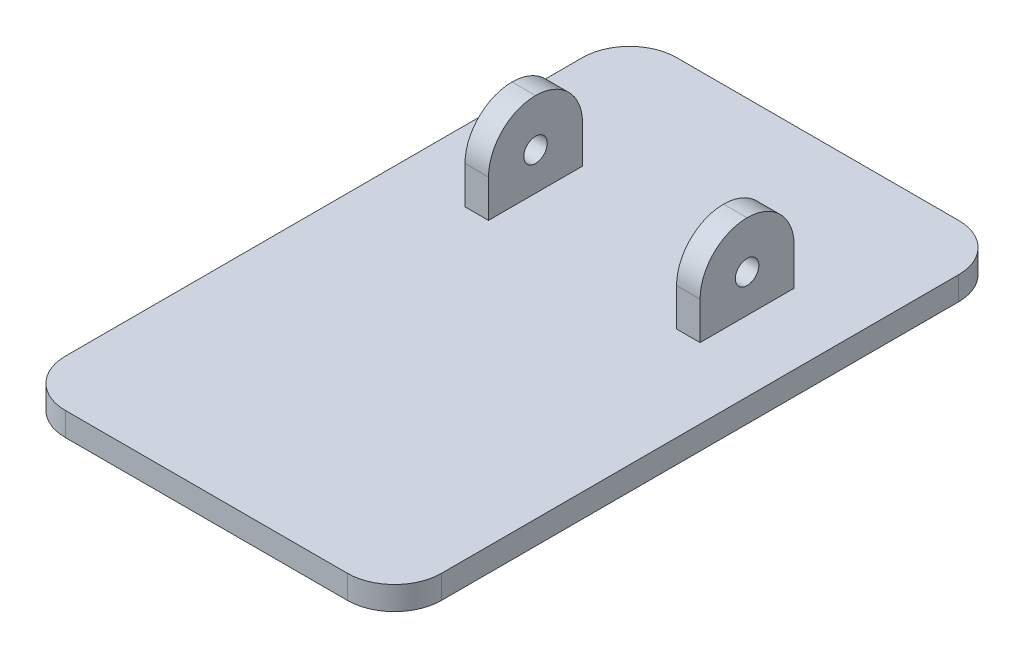
ISO-10303-21;
HEADER;
FILE_DESCRIPTION(('STEP AP214'),'2;1');
FILE_NAME('part.step','',(''),(''),'','','');
FILE_SCHEMA(('AUTOMOTIVE_DESIGN { 1 0 10303 214 1 1 1 1 }'));
ENDSEC;
DATA;
#1=APPLICATION_CONTEXT('core data for automotive mechanical design processes');
#2=APPLICATION_PROTOCOL_DEFINITION('international standard','automotive_design',2000,#1);
#3=PRODUCT_CONTEXT('',#1,'mechanical');
#4=PRODUCT('Part','Part','',(#3));
#5=PRODUCT_RELATED_PRODUCT_CATEGORY('part','',(#4));
#6=PRODUCT_DEFINITION_FORMATION('','',#4);
#7=PRODUCT_DEFINITION_CONTEXT('part definition',#1,'design');
#8=PRODUCT_DEFINITION('design','',#6,#7);
#9=PRODUCT_DEFINITION_SHAPE('','',#8);
#10=(LENGTH_UNIT() NAMED_UNIT(*) SI_UNIT(.MILLI.,.METRE.));
#11=(NAMED_UNIT(*) PLANE_ANGLE_UNIT() SI_UNIT($,.RADIAN.));
#12=(NAMED_UNIT(*) SI_UNIT($,.STERADIAN.) SOLID_ANGLE_UNIT());
#13=UNCERTAINTY_MEASURE_WITH_UNIT(LENGTH_MEASURE(1.E-05),#10,'distance_accuracy_value','');
#14=(GEOMETRIC_REPRESENTATION_CONTEXT(3) GLOBAL_UNCERTAINTY_ASSIGNED_CONTEXT((#13)) GLOBAL_UNIT_ASSIGNED_CONTEXT((#10,
#11,#12)) REPRESENTATION_CONTEXT('',''));
#15=CARTESIAN_POINT('',(0.,0.,0.));
#16=DIRECTION('',(0.,0.,1.));
#17=DIRECTION('',(1.,0.,0.));
#18=AXIS2_PLACEMENT_3D('',#15,#16,#17);
#19=CARTESIAN_POINT('',(40.,5.,-65.));
#20=DIRECTION('',(0.,0.,1.));
#21=DIRECTION('',(1.,0.,0.));
#22=AXIS2_PLACEMENT_3D('',#19,#20,#21);
#23=PLANE('',#22);
#24=DIRECTION('',(-1.,0.,0.));
#25=VECTOR('',#24,1.);
#26=CARTESIAN_POINT('',(40.,5.,-65.));
#27=LINE('',#26,#25);
#28=CARTESIAN_POINT('',(30.,5.,-65.));
#29=VERTEX_POINT('',#28);
#30=CARTESIAN_POINT('',(-30.,5.,-65.));
#31=VERTEX_POINT('',#30);
#32=EDGE_CURVE('E245',#29,#31,#27,.T.);
#33=ORIENTED_EDGE('',*,*,#32,.F.);
#34=DIRECTION('',(0.,-1.,0.));
#35=VECTOR('',#34,1.);
#36=CARTESIAN_POINT('',(30.,5.,-65.));
#37=LINE('',#36,#35);
#38=CARTESIAN_POINT('',(30.,0.,-65.));
#39=VERTEX_POINT('',#38);
#40=EDGE_CURVE('E324',#29,#39,#37,.T.);
#41=ORIENTED_EDGE('',*,*,#40,.T.);
#42=DIRECTION('',(-1.,0.,0.));
#43=VECTOR('',#42,1.);
#44=CARTESIAN_POINT('',(40.,0.,-65.));
#45=LINE('',#44,#43);
#46=CARTESIAN_POINT('',(-30.,0.,-65.));
#47=VERTEX_POINT('',#46);
#48=EDGE_CURVE('E244',#39,#47,#45,.T.);
#49=ORIENTED_EDGE('',*,*,#48,.T.);
#50=DIRECTION('',(0.,-1.,0.));
#51=VECTOR('',#50,1.);
#52=CARTESIAN_POINT('',(-30.,5.,-65.));
#53=LINE('',#52,#51);
#54=EDGE_CURVE('E321',#47,#31,#53,.F.);
#55=ORIENTED_EDGE('',*,*,#54,.T.);
#56=EDGE_LOOP('',(#33,#41,#49,#55));
#57=FACE_BOUND('',#56,.T.);
#58=ADVANCED_FACE('F47',(#57),#23,.F.);
#59=CARTESIAN_POINT('',(-40.,5.,65.));
#60=DIRECTION('',(-1.,0.,0.));
#61=DIRECTION('',(0.,0.,1.));
#62=AXIS2_PLACEMENT_3D('',#59,#60,#61);
#63=PLANE('',#62);
#64=DIRECTION('',(0.,0.,-1.));
#65=VECTOR('',#64,1.);
#66=CARTESIAN_POINT('',(-40.,0.,65.));
#67=LINE('',#66,#65);
#68=CARTESIAN_POINT('',(-40.,0.,55.));
#69=VERTEX_POINT('',#68);
#70=CARTESIAN_POINT('',(-40.,0.,-55.));
#71=VERTEX_POINT('',#70);
#72=EDGE_CURVE('E266',#69,#71,#67,.T.);
#73=ORIENTED_EDGE('',*,*,#72,.F.);
#74=DIRECTION('',(0.,-1.,0.));
#75=VECTOR('',#74,1.);
#76=CARTESIAN_POINT('',(-40.,5.,55.));
#77=LINE('',#76,#75);
#78=CARTESIAN_POINT('',(-40.,5.,55.));
#79=VERTEX_POINT('',#78);
#80=EDGE_CURVE('E299',#69,#79,#77,.F.);
#81=ORIENTED_EDGE('',*,*,#80,.T.);
#82=DIRECTION('',(0.,0.,-1.));
#83=VECTOR('',#82,1.);
#84=CARTESIAN_POINT('',(-40.,5.,65.));
#85=LINE('',#84,#83);
#86=CARTESIAN_POINT('',(-40.,5.,-55.));
#87=VERTEX_POINT('',#86);
#88=EDGE_CURVE('E249',#79,#87,#85,.T.);
#89=ORIENTED_EDGE('',*,*,#88,.T.);
#90=DIRECTION('',(0.,-1.,0.));
#91=VECTOR('',#90,1.);
#92=CARTESIAN_POINT('',(-40.,0.,-55.));
#93=LINE('',#92,#91);
#94=EDGE_CURVE('E295',#87,#71,#93,.T.);
#95=ORIENTED_EDGE('',*,*,#94,.T.);
#96=EDGE_LOOP('',(#73,#81,#89,#95));
#97=FACE_BOUND('',#96,.T.);
#98=ADVANCED_FACE('F414',(#97),#63,.T.);
#99=CARTESIAN_POINT('',(40.,5.,65.));
#100=DIRECTION('',(0.,0.,1.));
#101=DIRECTION('',(1.,0.,0.));
#102=AXIS2_PLACEMENT_3D('',#99,#100,#101);
#103=PLANE('',#102);
#104=DIRECTION('',(-1.,0.,0.));
#105=VECTOR('',#104,1.);
#106=CARTESIAN_POINT('',(40.,5.,65.));
#107=LINE('',#106,#105);
#108=CARTESIAN_POINT('',(30.,5.,65.));
#109=VERTEX_POINT('',#108);
#110=CARTESIAN_POINT('',(-30.,5.,65.));
#111=VERTEX_POINT('',#110);
#112=EDGE_CURVE('E254',#109,#111,#107,.T.);
#113=ORIENTED_EDGE('',*,*,#112,.T.);
#114=DIRECTION('',(0.,-1.,0.));
#115=VECTOR('',#114,1.);
#116=CARTESIAN_POINT('',(-30.,5.,65.));
#117=LINE('',#116,#115);
#118=CARTESIAN_POINT('',(-30.,0.,65.));
#119=VERTEX_POINT('',#118);
#120=EDGE_CURVE('E279',#111,#119,#117,.T.);
#121=ORIENTED_EDGE('',*,*,#120,.T.);
#122=DIRECTION('',(-1.,0.,0.));
#123=VECTOR('',#122,1.);
#124=CARTESIAN_POINT('',(40.,0.,65.));
#125=LINE('',#124,#123);
#126=CARTESIAN_POINT('',(30.,0.,65.));
#127=VERTEX_POINT('',#126);
#128=EDGE_CURVE('E270',#127,#119,#125,.T.);
#129=ORIENTED_EDGE('',*,*,#128,.F.);
#130=DIRECTION('',(0.,-1.,0.));
#131=VECTOR('',#130,1.);
#132=CARTESIAN_POINT('',(30.,5.,65.));
#133=LINE('',#132,#131);
#134=EDGE_CURVE('E262',#127,#109,#133,.F.);
#135=ORIENTED_EDGE('',*,*,#134,.T.);
#136=EDGE_LOOP('',(#113,#121,#129,#135));
#137=FACE_BOUND('',#136,.T.);
#138=ADVANCED_FACE('F420',(#137),#103,.T.);
#139=CARTESIAN_POINT('',(40.,5.,65.));
#140=DIRECTION('',(-1.,0.,0.));
#141=DIRECTION('',(0.,0.,1.));
#142=AXIS2_PLACEMENT_3D('',#139,#140,#141);
#143=PLANE('',#142);
#144=DIRECTION('',(0.,0.,-1.));
#145=VECTOR('',#144,1.);
#146=CARTESIAN_POINT('',(40.,5.,65.));
#147=LINE('',#146,#145);
#148=CARTESIAN_POINT('',(40.,5.,55.));
#149=VERTEX_POINT('',#148);
#150=CARTESIAN_POINT('',(40.,5.,-55.));
#151=VERTEX_POINT('',#150);
#152=EDGE_CURVE('E258',#149,#151,#147,.T.);
#153=ORIENTED_EDGE('',*,*,#152,.F.);
#154=DIRECTION('',(0.,-1.,0.));
#155=VECTOR('',#154,1.);
#156=CARTESIAN_POINT('',(40.,0.,55.));
#157=LINE('',#156,#155);
#158=CARTESIAN_POINT('',(40.,0.,55.));
#159=VERTEX_POINT('',#158);
#160=EDGE_CURVE('E317',#149,#159,#157,.T.);
#161=ORIENTED_EDGE('',*,*,#160,.T.);
#162=DIRECTION('',(0.,0.,-1.));
#163=VECTOR('',#162,1.);
#164=CARTESIAN_POINT('',(40.,0.,65.));
#165=LINE('',#164,#163);
#166=CARTESIAN_POINT('',(40.,0.,-55.));
#167=VERTEX_POINT('',#166);
#168=EDGE_CURVE('E250',#159,#167,#165,.T.);
#169=ORIENTED_EDGE('',*,*,#168,.T.);
#170=DIRECTION('',(0.,-1.,0.));
#171=VECTOR('',#170,1.);
#172=CARTESIAN_POINT('',(40.,5.,-55.));
#173=LINE('',#172,#171);
#174=EDGE_CURVE('E314',#167,#151,#173,.F.);
#175=ORIENTED_EDGE('',*,*,#174,.T.);
#176=EDGE_LOOP('',(#153,#161,#169,#175));
#177=FACE_BOUND('',#176,.T.);
#178=ADVANCED_FACE('F484',(#177),#143,.F.);
#179=CARTESIAN_POINT('',(0.,5.,0.));
#180=DIRECTION('',(0.,-1.,0.));
#181=DIRECTION('',(0.,0.,-1.));
#182=AXIS2_PLACEMENT_3D('',#179,#180,#181);
#183=PLANE('',#182);
#184=DIRECTION('',(0.,0.,-1.));
#185=VECTOR('',#184,1.);
#186=CARTESIAN_POINT('',(20.,5.,0.));
#187=LINE('',#186,#185);
#188=CARTESIAN_POINT('',(20.,5.,-15.));
#189=VERTEX_POINT('',#188);
#190=CARTESIAN_POINT('',(20.,5.,-35.));
#191=VERTEX_POINT('',#190);
#192=EDGE_CURVE('E176',#189,#191,#187,.T.);
#193=ORIENTED_EDGE('',*,*,#192,.T.);
#194=DIRECTION('',(1.,0.,0.));
#195=VECTOR('',#194,1.);
#196=CARTESIAN_POINT('',(0.,5.,-35.));
#197=LINE('',#196,#195);
#198=CARTESIAN_POINT('',(25.,5.,-35.));
#199=VERTEX_POINT('',#198);
#200=EDGE_CURVE('E187',#191,#199,#197,.T.);
#201=ORIENTED_EDGE('',*,*,#200,.T.);
#202=DIRECTION('',(0.,0.,1.));
#203=VECTOR('',#202,1.);
#204=CARTESIAN_POINT('',(25.,5.,0.));
#205=LINE('',#204,#203);
#206=CARTESIAN_POINT('',(25.,5.,-15.));
#207=VERTEX_POINT('',#206);
#208=EDGE_CURVE('E204',#199,#207,#205,.T.);
#209=ORIENTED_EDGE('',*,*,#208,.T.);
#210=DIRECTION('',(-1.,0.,0.));
#211=VECTOR('',#210,1.);
#212=CARTESIAN_POINT('',(0.,5.,-15.));
#213=LINE('',#212,#211);
#214=EDGE_CURVE('E200',#207,#189,#213,.T.);
#215=ORIENTED_EDGE('',*,*,#214,.T.);
#216=EDGE_LOOP('',(#193,#201,#209,#215));
#217=FACE_BOUND('',#216,.T.);
#218=DIRECTION('',(1.,0.,0.));
#219=VECTOR('',#218,1.);
#220=CARTESIAN_POINT('',(0.,5.,-35.));
#221=LINE('',#220,#219);
#222=CARTESIAN_POINT('',(-25.,5.,-35.));
#223=VERTEX_POINT('',#222);
#224=CARTESIAN_POINT('',(-20.,5.,-35.));
#225=VERTEX_POINT('',#224);
#226=EDGE_CURVE('E220',#223,#225,#221,.T.);
#227=ORIENTED_EDGE('',*,*,#226,.T.);
#228=DIRECTION('',(0.,0.,1.));
#229=VECTOR('',#228,1.);
#230=CARTESIAN_POINT('',(-20.,5.,0.));
#231=LINE('',#230,#229);
#232=CARTESIAN_POINT('',(-20.,5.,-15.));
#233=VERTEX_POINT('',#232);
#234=EDGE_CURVE('E183',#225,#233,#231,.T.);
#235=ORIENTED_EDGE('',*,*,#234,.T.);
#236=DIRECTION('',(1.,0.,0.));
#237=VECTOR('',#236,1.);
#238=CARTESIAN_POINT('',(0.,5.,-15.));
#239=LINE('',#238,#237);
#240=CARTESIAN_POINT('',(-25.,5.,-15.));
#241=VERTEX_POINT('',#240);
#242=EDGE_CURVE('E228',#241,#233,#239,.T.);
#243=ORIENTED_EDGE('',*,*,#242,.F.);
#244=DIRECTION('',(0.,0.,1.));
#245=VECTOR('',#244,1.);
#246=CARTESIAN_POINT('',(-25.,5.,0.));
#247=LINE('',#246,#245);
#248=EDGE_CURVE('E224',#223,#241,#247,.T.);
#249=ORIENTED_EDGE('',*,*,#248,.F.);
#250=EDGE_LOOP('',(#227,#235,#243,#249));
#251=FACE_BOUND('',#250,.T.);
#252=ORIENTED_EDGE('',*,*,#88,.F.);
#253=CARTESIAN_POINT('',(-30.,5.,55.));
#254=DIRECTION('',(0.,-1.,0.));
#255=DIRECTION('',(0.,0.,-1.));
#256=AXIS2_PLACEMENT_3D('',#253,#254,#255);
#257=CIRCLE('',#256,10.);
#258=EDGE_CURVE('E311',#79,#111,#257,.F.);
#259=ORIENTED_EDGE('',*,*,#258,.T.);
#260=ORIENTED_EDGE('',*,*,#112,.F.);
#261=CARTESIAN_POINT('',(30.,5.,55.));
#262=DIRECTION('',(0.,-1.,0.));
#263=DIRECTION('',(0.,0.,-1.));
#264=AXIS2_PLACEMENT_3D('',#261,#262,#263);
#265=CIRCLE('',#264,10.);
#266=EDGE_CURVE('E308',#109,#149,#265,.F.);
#267=ORIENTED_EDGE('',*,*,#266,.T.);
#268=ORIENTED_EDGE('',*,*,#152,.T.);
#269=CARTESIAN_POINT('',(30.,5.,-55.));
#270=DIRECTION('',(0.,-1.,0.));
#271=DIRECTION('',(0.,0.,-1.));
#272=AXIS2_PLACEMENT_3D('',#269,#270,#271);
#273=CIRCLE('',#272,10.);
#274=EDGE_CURVE('E305',#151,#29,#273,.F.);
#275=ORIENTED_EDGE('',*,*,#274,.T.);
#276=ORIENTED_EDGE('',*,*,#32,.T.);
#277=CARTESIAN_POINT('',(-30.,5.,-55.));
#278=DIRECTION('',(0.,-1.,0.));
#279=DIRECTION('',(0.,0.,-1.));
#280=AXIS2_PLACEMENT_3D('',#277,#278,#279);
#281=CIRCLE('',#280,10.);
#282=EDGE_CURVE('E302',#31,#87,#281,.F.);
#283=ORIENTED_EDGE('',*,*,#282,.T.);
#284=EDGE_LOOP('',(#252,#259,#260,#267,#268,#275,#276,#283));
#285=FACE_BOUND('',#284,.T.);
#286=ADVANCED_FACE('F197',(#217,#251,#285),#183,.F.);
#287=CARTESIAN_POINT('',(0.,0.,0.));
#288=DIRECTION('',(0.,-1.,0.));
#289=DIRECTION('',(0.,0.,-1.));
#290=AXIS2_PLACEMENT_3D('',#287,#288,#289);
#291=PLANE('',#290);
#292=ORIENTED_EDGE('',*,*,#128,.T.);
#293=CARTESIAN_POINT('',(-30.,0.,55.));
#294=DIRECTION('',(0.,-1.,0.));
#295=DIRECTION('',(0.,0.,-1.));
#296=AXIS2_PLACEMENT_3D('',#293,#294,#295);
#297=CIRCLE('',#296,10.);
#298=EDGE_CURVE('E292',#119,#69,#297,.T.);
#299=ORIENTED_EDGE('',*,*,#298,.T.);
#300=ORIENTED_EDGE('',*,*,#72,.T.);
#301=CARTESIAN_POINT('',(-30.,0.,-55.));
#302=DIRECTION('',(0.,-1.,0.));
#303=DIRECTION('',(0.,0.,-1.));
#304=AXIS2_PLACEMENT_3D('',#301,#302,#303);
#305=CIRCLE('',#304,10.);
#306=EDGE_CURVE('E283',#71,#47,#305,.T.);
#307=ORIENTED_EDGE('',*,*,#306,.T.);
#308=ORIENTED_EDGE('',*,*,#48,.F.);
#309=CARTESIAN_POINT('',(30.,0.,-55.));
#310=DIRECTION('',(0.,-1.,0.));
#311=DIRECTION('',(0.,0.,-1.));
#312=AXIS2_PLACEMENT_3D('',#309,#310,#311);
#313=CIRCLE('',#312,10.);
#314=EDGE_CURVE('E286',#39,#167,#313,.T.);
#315=ORIENTED_EDGE('',*,*,#314,.T.);
#316=ORIENTED_EDGE('',*,*,#168,.F.);
#317=CARTESIAN_POINT('',(30.,0.,55.));
#318=DIRECTION('',(0.,-1.,0.));
#319=DIRECTION('',(0.,0.,-1.));
#320=AXIS2_PLACEMENT_3D('',#317,#318,#319);
#321=CIRCLE('',#320,10.);
#322=EDGE_CURVE('E289',#159,#127,#321,.T.);
#323=ORIENTED_EDGE('',*,*,#322,.T.);
#324=EDGE_LOOP('',(#292,#299,#300,#307,#308,#315,#316,#323));
#325=FACE_BOUND('',#324,.T.);
#326=ADVANCED_FACE('F430',(#325),#291,.T.);
#327=CARTESIAN_POINT('',(-30.,5.,55.));
#328=DIRECTION('',(0.,-1.,0.));
#329=DIRECTION('',(0.,0.,-1.));
#330=AXIS2_PLACEMENT_3D('',#327,#328,#329);
#331=CYLINDRICAL_SURFACE('',#330,10.);
#332=ORIENTED_EDGE('',*,*,#258,.F.);
#333=ORIENTED_EDGE('',*,*,#80,.F.);
#334=ORIENTED_EDGE('',*,*,#298,.F.);
#335=ORIENTED_EDGE('',*,*,#120,.F.);
#336=EDGE_LOOP('',(#332,#333,#334,#335));
#337=FACE_BOUND('',#336,.T.);
#338=ADVANCED_FACE('F426',(#337),#331,.T.);
#339=CARTESIAN_POINT('',(30.,5.,55.));
#340=DIRECTION('',(0.,1.,0.));
#341=DIRECTION('',(0.,0.,1.));
#342=AXIS2_PLACEMENT_3D('',#339,#340,#341);
#343=CYLINDRICAL_SURFACE('',#342,10.);
#344=ORIENTED_EDGE('',*,*,#266,.F.);
#345=ORIENTED_EDGE('',*,*,#134,.F.);
#346=ORIENTED_EDGE('',*,*,#322,.F.);
#347=ORIENTED_EDGE('',*,*,#160,.F.);
#348=EDGE_LOOP('',(#344,#345,#346,#347));
#349=FACE_BOUND('',#348,.T.);
#350=ADVANCED_FACE('F429',(#349),#343,.T.);
#351=CARTESIAN_POINT('',(30.,5.,-55.));
#352=DIRECTION('',(0.,-1.,0.));
#353=DIRECTION('',(0.,0.,-1.));
#354=AXIS2_PLACEMENT_3D('',#351,#352,#353);
#355=CYLINDRICAL_SURFACE('',#354,10.);
#356=ORIENTED_EDGE('',*,*,#274,.F.);
#357=ORIENTED_EDGE('',*,*,#174,.F.);
#358=ORIENTED_EDGE('',*,*,#314,.F.);
#359=ORIENTED_EDGE('',*,*,#40,.F.);
#360=EDGE_LOOP('',(#356,#357,#358,#359));
#361=FACE_BOUND('',#360,.T.);
#362=ADVANCED_FACE('F434',(#361),#355,.T.);
#363=CARTESIAN_POINT('',(-30.,5.,-55.));
#364=DIRECTION('',(0.,1.,0.));
#365=DIRECTION('',(0.,0.,1.));
#366=AXIS2_PLACEMENT_3D('',#363,#364,#365);
#367=CYLINDRICAL_SURFACE('',#366,10.);
#368=ORIENTED_EDGE('',*,*,#282,.F.);
#369=ORIENTED_EDGE('',*,*,#54,.F.);
#370=ORIENTED_EDGE('',*,*,#306,.F.);
#371=ORIENTED_EDGE('',*,*,#94,.F.);
#372=EDGE_LOOP('',(#368,#369,#370,#371));
#373=FACE_BOUND('',#372,.T.);
#374=ADVANCED_FACE('F438',(#373),#367,.T.);
#375=CARTESIAN_POINT('',(-20.,23.,0.));
#376=DIRECTION('',(1.,0.,0.));
#377=DIRECTION('',(0.,0.,-1.));
#378=AXIS2_PLACEMENT_3D('',#375,#376,#377);
#379=PLANE('',#378);
#380=CARTESIAN_POINT('',(-20.,13.,-25.));
#381=DIRECTION('',(1.,0.,0.));
#382=DIRECTION('',(0.,0.,-1.));
#383=AXIS2_PLACEMENT_3D('',#380,#381,#382);
#384=CIRCLE('',#383,2.5);
#385=CARTESIAN_POINT('',(-20.,13.,-27.5));
#386=VERTEX_POINT('',#385);
#387=EDGE_CURVE('E365',#386,#386,#384,.T.);
#388=ORIENTED_EDGE('',*,*,#387,.F.);
#389=EDGE_LOOP('',(#388));
#390=FACE_BOUND('',#389,.T.);
#391=CARTESIAN_POINT('',(-20.,13.,-25.));
#392=DIRECTION('',(1.,0.,0.));
#393=DIRECTION('',(0.,0.,-1.));
#394=AXIS2_PLACEMENT_3D('',#391,#392,#393);
#395=CIRCLE('',#394,10.);
#396=CARTESIAN_POINT('',(-20.,13.,-35.));
#397=VERTEX_POINT('',#396);
#398=CARTESIAN_POINT('',(-20.,23.,-25.));
#399=VERTEX_POINT('',#398);
#400=EDGE_CURVE('E346',#397,#399,#395,.T.);
#401=ORIENTED_EDGE('',*,*,#400,.T.);
#402=CARTESIAN_POINT('',(-20.,13.,-25.));
#403=DIRECTION('',(1.,0.,0.));
#404=DIRECTION('',(0.,0.,-1.));
#405=AXIS2_PLACEMENT_3D('',#402,#403,#404);
#406=CIRCLE('',#405,10.);
#407=CARTESIAN_POINT('',(-20.,13.,-15.));
#408=VERTEX_POINT('',#407);
#409=EDGE_CURVE('E349',#399,#408,#406,.T.);
#410=ORIENTED_EDGE('',*,*,#409,.T.);
#411=DIRECTION('',(0.,-1.,0.));
#412=VECTOR('',#411,1.);
#413=CARTESIAN_POINT('',(-20.,23.,-15.));
#414=LINE('',#413,#412);
#415=EDGE_CURVE('E232',#408,#233,#414,.T.);
#416=ORIENTED_EDGE('',*,*,#415,.T.);
#417=ORIENTED_EDGE('',*,*,#234,.F.);
#418=DIRECTION('',(0.,-1.,0.));
#419=VECTOR('',#418,1.);
#420=CARTESIAN_POINT('',(-20.,23.,-35.));
#421=LINE('',#420,#419);
#422=EDGE_CURVE('E241',#397,#225,#421,.T.);
#423=ORIENTED_EDGE('',*,*,#422,.F.);
#424=EDGE_LOOP('',(#401,#410,#416,#417,#423));
#425=FACE_BOUND('',#424,.T.);
#426=ADVANCED_FACE('F442',(#390,#425),#379,.T.);
#427=CARTESIAN_POINT('',(0.,23.,-35.));
#428=DIRECTION('',(0.,0.,-1.));
#429=DIRECTION('',(-1.,0.,0.));
#430=AXIS2_PLACEMENT_3D('',#427,#428,#429);
#431=PLANE('',#430);
#432=DIRECTION('',(0.,-1.,0.));
#433=VECTOR('',#432,1.);
#434=CARTESIAN_POINT('',(-25.,23.,-35.));
#435=LINE('',#434,#433);
#436=CARTESIAN_POINT('',(-25.,13.,-35.));
#437=VERTEX_POINT('',#436);
#438=EDGE_CURVE('E238',#437,#223,#435,.T.);
#439=ORIENTED_EDGE('',*,*,#438,.F.);
#440=DIRECTION('',(1.,0.,0.));
#441=VECTOR('',#440,1.);
#442=CARTESIAN_POINT('',(0.,13.,-35.));
#443=LINE('',#442,#441);
#444=EDGE_CURVE('E11',#437,#397,#443,.T.);
#445=ORIENTED_EDGE('',*,*,#444,.T.);
#446=ORIENTED_EDGE('',*,*,#422,.T.);
#447=ORIENTED_EDGE('',*,*,#226,.F.);
#448=EDGE_LOOP('',(#439,#445,#446,#447));
#449=FACE_BOUND('',#448,.T.);
#450=ADVANCED_FACE('F468',(#449),#431,.T.);
#451=CARTESIAN_POINT('',(-25.,23.,0.));
#452=DIRECTION('',(1.,0.,0.));
#453=DIRECTION('',(0.,0.,-1.));
#454=AXIS2_PLACEMENT_3D('',#451,#452,#453);
#455=PLANE('',#454);
#456=CARTESIAN_POINT('',(-25.,13.,-25.));
#457=DIRECTION('',(-1.,0.,0.));
#458=DIRECTION('',(0.,0.,1.));
#459=AXIS2_PLACEMENT_3D('',#456,#457,#458);
#460=CIRCLE('',#459,2.5);
#461=CARTESIAN_POINT('',(-25.,13.,-22.5));
#462=VERTEX_POINT('',#461);
#463=EDGE_CURVE('E378',#462,#462,#460,.T.);
#464=ORIENTED_EDGE('',*,*,#463,.F.);
#465=EDGE_LOOP('',(#464));
#466=FACE_BOUND('',#465,.T.);
#467=DIRECTION('',(0.,-1.,0.));
#468=VECTOR('',#467,1.);
#469=CARTESIAN_POINT('',(-25.,23.,-15.));
#470=LINE('',#469,#468);
#471=CARTESIAN_POINT('',(-25.,13.,-15.));
#472=VERTEX_POINT('',#471);
#473=EDGE_CURVE('E235',#472,#241,#470,.T.);
#474=ORIENTED_EDGE('',*,*,#473,.F.);
#475=CARTESIAN_POINT('',(-25.,13.,-25.));
#476=DIRECTION('',(1.,0.,0.));
#477=DIRECTION('',(0.,0.,-1.));
#478=AXIS2_PLACEMENT_3D('',#475,#476,#477);
#479=CIRCLE('',#478,10.);
#480=CARTESIAN_POINT('',(-25.,23.,-25.));
#481=VERTEX_POINT('',#480);
#482=EDGE_CURVE('E57',#472,#481,#479,.F.);
#483=ORIENTED_EDGE('',*,*,#482,.T.);
#484=CARTESIAN_POINT('',(-25.,13.,-25.));
#485=DIRECTION('',(1.,0.,0.));
#486=DIRECTION('',(0.,0.,-1.));
#487=AXIS2_PLACEMENT_3D('',#484,#485,#486);
#488=CIRCLE('',#487,10.);
#489=EDGE_CURVE('E65',#481,#437,#488,.F.);
#490=ORIENTED_EDGE('',*,*,#489,.T.);
#491=ORIENTED_EDGE('',*,*,#438,.T.);
#492=ORIENTED_EDGE('',*,*,#248,.T.);
#493=EDGE_LOOP('',(#474,#483,#490,#491,#492));
#494=FACE_BOUND('',#493,.T.);
#495=ADVANCED_FACE('F462',(#466,#494),#455,.F.);
#496=CARTESIAN_POINT('',(0.,23.,-15.));
#497=DIRECTION('',(0.,0.,-1.));
#498=DIRECTION('',(-1.,0.,0.));
#499=AXIS2_PLACEMENT_3D('',#496,#497,#498);
#500=PLANE('',#499);
#501=ORIENTED_EDGE('',*,*,#415,.F.);
#502=DIRECTION('',(1.,0.,0.));
#503=VECTOR('',#502,1.);
#504=CARTESIAN_POINT('',(-25.,13.,-15.));
#505=LINE('',#504,#503);
#506=EDGE_CURVE('E352',#408,#472,#505,.F.);
#507=ORIENTED_EDGE('',*,*,#506,.T.);
#508=ORIENTED_EDGE('',*,*,#473,.T.);
#509=ORIENTED_EDGE('',*,*,#242,.T.);
#510=EDGE_LOOP('',(#501,#507,#508,#509));
#511=FACE_BOUND('',#510,.T.);
#512=ADVANCED_FACE('F460',(#511),#500,.F.);
#513=CARTESIAN_POINT('',(0.,23.,-35.));
#514=DIRECTION('',(0.,0.,-1.));
#515=DIRECTION('',(-1.,0.,0.));
#516=AXIS2_PLACEMENT_3D('',#513,#514,#515);
#517=PLANE('',#516);
#518=DIRECTION('',(0.,-1.,0.));
#519=VECTOR('',#518,1.);
#520=CARTESIAN_POINT('',(20.,23.,-35.));
#521=LINE('',#520,#519);
#522=CARTESIAN_POINT('',(20.,13.,-35.));
#523=VERTEX_POINT('',#522);
#524=EDGE_CURVE('E171',#523,#191,#521,.T.);
#525=ORIENTED_EDGE('',*,*,#524,.F.);
#526=DIRECTION('',(1.,0.,0.));
#527=VECTOR('',#526,1.);
#528=CARTESIAN_POINT('',(0.,13.,-35.));
#529=LINE('',#528,#527);
#530=CARTESIAN_POINT('',(25.,13.,-35.));
#531=VERTEX_POINT('',#530);
#532=EDGE_CURVE('E343',#523,#531,#529,.T.);
#533=ORIENTED_EDGE('',*,*,#532,.T.);
#534=DIRECTION('',(0.,-1.,0.));
#535=VECTOR('',#534,1.);
#536=CARTESIAN_POINT('',(25.,23.,-35.));
#537=LINE('',#536,#535);
#538=EDGE_CURVE('E190',#531,#199,#537,.T.);
#539=ORIENTED_EDGE('',*,*,#538,.T.);
#540=ORIENTED_EDGE('',*,*,#200,.F.);
#541=EDGE_LOOP('',(#525,#533,#539,#540));
#542=FACE_BOUND('',#541,.T.);
#543=ADVANCED_FACE('F188',(#542),#517,.T.);
#544=CARTESIAN_POINT('',(20.,23.,0.));
#545=DIRECTION('',(-1.,0.,0.));
#546=DIRECTION('',(0.,0.,1.));
#547=AXIS2_PLACEMENT_3D('',#544,#545,#546);
#548=PLANE('',#547);
#549=CARTESIAN_POINT('',(20.,13.,-25.));
#550=DIRECTION('',(-1.,0.,0.));
#551=DIRECTION('',(0.,0.,1.));
#552=AXIS2_PLACEMENT_3D('',#549,#550,#551);
#553=CIRCLE('',#552,2.5);
#554=CARTESIAN_POINT('',(20.,13.,-22.5));
#555=VERTEX_POINT('',#554);
#556=EDGE_CURVE('E371',#555,#555,#553,.T.);
#557=ORIENTED_EDGE('',*,*,#556,.F.);
#558=EDGE_LOOP('',(#557));
#559=FACE_BOUND('',#558,.T.);
#560=DIRECTION('',(0.,-1.,0.));
#561=VECTOR('',#560,1.);
#562=CARTESIAN_POINT('',(20.,23.,-15.));
#563=LINE('',#562,#561);
#564=CARTESIAN_POINT('',(20.,13.,-15.));
#565=VERTEX_POINT('',#564);
#566=EDGE_CURVE('E184',#565,#189,#563,.T.);
#567=ORIENTED_EDGE('',*,*,#566,.F.);
#568=CARTESIAN_POINT('',(20.,13.,-25.));
#569=DIRECTION('',(-1.,0.,0.));
#570=DIRECTION('',(0.,0.,1.));
#571=AXIS2_PLACEMENT_3D('',#568,#569,#570);
#572=CIRCLE('',#571,10.);
#573=CARTESIAN_POINT('',(20.,23.,-25.));
#574=VERTEX_POINT('',#573);
#575=EDGE_CURVE('E334',#565,#574,#572,.T.);
#576=ORIENTED_EDGE('',*,*,#575,.T.);
#577=CARTESIAN_POINT('',(20.,13.,-25.));
#578=DIRECTION('',(-1.,0.,0.));
#579=DIRECTION('',(0.,0.,1.));
#580=AXIS2_PLACEMENT_3D('',#577,#578,#579);
#581=CIRCLE('',#580,10.);
#582=EDGE_CURVE('E179',#574,#523,#581,.T.);
#583=ORIENTED_EDGE('',*,*,#582,.T.);
#584=ORIENTED_EDGE('',*,*,#524,.T.);
#585=ORIENTED_EDGE('',*,*,#192,.F.);
#586=EDGE_LOOP('',(#567,#576,#583,#584,#585));
#587=FACE_BOUND('',#586,.T.);
#588=ADVANCED_FACE('F174',(#559,#587),#548,.T.);
#589=CARTESIAN_POINT('',(0.,23.,-15.));
#590=DIRECTION('',(0.,0.,1.));
#591=DIRECTION('',(1.,0.,0.));
#592=AXIS2_PLACEMENT_3D('',#589,#590,#591);
#593=PLANE('',#592);
#594=DIRECTION('',(0.,-1.,0.));
#595=VECTOR('',#594,1.);
#596=CARTESIAN_POINT('',(25.,23.,-15.));
#597=LINE('',#596,#595);
#598=CARTESIAN_POINT('',(25.,13.,-15.));
#599=VERTEX_POINT('',#598);
#600=EDGE_CURVE('E212',#599,#207,#597,.T.);
#601=ORIENTED_EDGE('',*,*,#600,.F.);
#602=DIRECTION('',(-1.,0.,0.));
#603=VECTOR('',#602,1.);
#604=CARTESIAN_POINT('',(0.,13.,-15.));
#605=LINE('',#604,#603);
#606=EDGE_CURVE('E328',#599,#565,#605,.T.);
#607=ORIENTED_EDGE('',*,*,#606,.T.);
#608=ORIENTED_EDGE('',*,*,#566,.T.);
#609=ORIENTED_EDGE('',*,*,#214,.F.);
#610=EDGE_LOOP('',(#601,#607,#608,#609));
#611=FACE_BOUND('',#610,.T.);
#612=ADVANCED_FACE('F393',(#611),#593,.T.);
#613=CARTESIAN_POINT('',(25.,23.,0.));
#614=DIRECTION('',(1.,0.,0.));
#615=DIRECTION('',(0.,0.,-1.));
#616=AXIS2_PLACEMENT_3D('',#613,#614,#615);
#617=PLANE('',#616);
#618=CARTESIAN_POINT('',(25.,13.,-25.));
#619=DIRECTION('',(1.,0.,0.));
#620=DIRECTION('',(0.,0.,-1.));
#621=AXIS2_PLACEMENT_3D('',#618,#619,#620);
#622=CIRCLE('',#621,2.5);
#623=CARTESIAN_POINT('',(25.,13.,-27.5));
#624=VERTEX_POINT('',#623);
#625=EDGE_CURVE('E51',#624,#624,#622,.T.);
#626=ORIENTED_EDGE('',*,*,#625,.F.);
#627=EDGE_LOOP('',(#626));
#628=FACE_BOUND('',#627,.T.);
#629=CARTESIAN_POINT('',(25.,13.,-25.));
#630=DIRECTION('',(1.,0.,0.));
#631=DIRECTION('',(0.,0.,-1.));
#632=AXIS2_PLACEMENT_3D('',#629,#630,#631);
#633=CIRCLE('',#632,10.);
#634=CARTESIAN_POINT('',(25.,23.,-25.));
#635=VERTEX_POINT('',#634);
#636=EDGE_CURVE('E337',#531,#635,#633,.T.);
#637=ORIENTED_EDGE('',*,*,#636,.T.);
#638=CARTESIAN_POINT('',(25.,13.,-25.));
#639=DIRECTION('',(1.,0.,0.));
#640=DIRECTION('',(0.,0.,-1.));
#641=AXIS2_PLACEMENT_3D('',#638,#639,#640);
#642=CIRCLE('',#641,10.);
#643=EDGE_CURVE('E340',#635,#599,#642,.T.);
#644=ORIENTED_EDGE('',*,*,#643,.T.);
#645=ORIENTED_EDGE('',*,*,#600,.T.);
#646=ORIENTED_EDGE('',*,*,#208,.F.);
#647=ORIENTED_EDGE('',*,*,#538,.F.);
#648=EDGE_LOOP('',(#637,#644,#645,#646,#647));
#649=FACE_BOUND('',#648,.T.);
#650=ADVANCED_FACE('F389',(#628,#649),#617,.T.);
#651=CARTESIAN_POINT('',(0.,13.,-25.));
#652=DIRECTION('',(1.,0.,0.));
#653=DIRECTION('',(0.,0.,-1.));
#654=AXIS2_PLACEMENT_3D('',#651,#652,#653);
#655=CYLINDRICAL_SURFACE('',#654,10.);
#656=DIRECTION('',(1.,0.,0.));
#657=VECTOR('',#656,1.);
#658=CARTESIAN_POINT('',(0.,23.,-25.));
#659=LINE('',#658,#657);
#660=EDGE_CURVE('E195',#635,#574,#659,.F.);
#661=ORIENTED_EDGE('',*,*,#660,.F.);
#662=ORIENTED_EDGE('',*,*,#636,.F.);
#663=ORIENTED_EDGE('',*,*,#532,.F.);
#664=ORIENTED_EDGE('',*,*,#582,.F.);
#665=EDGE_LOOP('',(#661,#662,#663,#664));
#666=FACE_BOUND('',#665,.T.);
#667=ADVANCED_FACE('F392',(#666),#655,.T.);
#668=CARTESIAN_POINT('',(0.,13.,-25.));
#669=DIRECTION('',(-1.,0.,0.));
#670=DIRECTION('',(0.,0.,1.));
#671=AXIS2_PLACEMENT_3D('',#668,#669,#670);
#672=CYLINDRICAL_SURFACE('',#671,10.);
#673=ORIENTED_EDGE('',*,*,#643,.F.);
#674=ORIENTED_EDGE('',*,*,#660,.T.);
#675=ORIENTED_EDGE('',*,*,#575,.F.);
#676=ORIENTED_EDGE('',*,*,#606,.F.);
#677=EDGE_LOOP('',(#673,#674,#675,#676));
#678=FACE_BOUND('',#677,.T.);
#679=ADVANCED_FACE('F402',(#678),#672,.T.);
#680=CARTESIAN_POINT('',(0.,13.,-25.));
#681=DIRECTION('',(1.,0.,0.));
#682=DIRECTION('',(0.,0.,-1.));
#683=AXIS2_PLACEMENT_3D('',#680,#681,#682);
#684=CYLINDRICAL_SURFACE('',#683,10.);
#685=ORIENTED_EDGE('',*,*,#444,.F.);
#686=ORIENTED_EDGE('',*,*,#489,.F.);
#687=DIRECTION('',(1.,0.,0.));
#688=VECTOR('',#687,1.);
#689=CARTESIAN_POINT('',(0.,23.,-25.));
#690=LINE('',#689,#688);
#691=EDGE_CURVE('E362',#399,#481,#690,.F.);
#692=ORIENTED_EDGE('',*,*,#691,.F.);
#693=ORIENTED_EDGE('',*,*,#400,.F.);
#694=EDGE_LOOP('',(#685,#686,#692,#693));
#695=FACE_BOUND('',#694,.T.);
#696=ADVANCED_FACE('F49',(#695),#684,.T.);
#697=CARTESIAN_POINT('',(0.,13.,-25.));
#698=DIRECTION('',(-1.,0.,0.));
#699=DIRECTION('',(0.,0.,1.));
#700=AXIS2_PLACEMENT_3D('',#697,#698,#699);
#701=CYLINDRICAL_SURFACE('',#700,10.);
#702=ORIENTED_EDGE('',*,*,#482,.F.);
#703=ORIENTED_EDGE('',*,*,#506,.F.);
#704=ORIENTED_EDGE('',*,*,#409,.F.);
#705=ORIENTED_EDGE('',*,*,#691,.T.);
#706=EDGE_LOOP('',(#702,#703,#704,#705));
#707=FACE_BOUND('',#706,.T.);
#708=ADVANCED_FACE('F446',(#707),#701,.T.);
#709=CARTESIAN_POINT('',(75.,13.,-25.0000000000001));
#710=DIRECTION('',(-1.,0.,0.));
#711=DIRECTION('',(0.,0.,1.));
#712=AXIS2_PLACEMENT_3D('',#709,#710,#711);
#713=CYLINDRICAL_SURFACE('',#712,2.5);
#714=ORIENTED_EDGE('',*,*,#556,.T.);
#715=EDGE_LOOP('',(#714));
#716=FACE_BOUND('',#715,.T.);
#717=ORIENTED_EDGE('',*,*,#625,.T.);
#718=EDGE_LOOP('',(#717));
#719=FACE_BOUND('',#718,.T.);
#720=ADVANCED_FACE('F387',(#716,#719),#713,.F.);
#721=ORIENTED_EDGE('',*,*,#387,.T.);
#722=EDGE_LOOP('',(#721));
#723=FACE_BOUND('',#722,.T.);
#724=ORIENTED_EDGE('',*,*,#463,.T.);
#725=EDGE_LOOP('',(#724));
#726=FACE_BOUND('',#725,.T.);
#727=ADVANCED_FACE('F453',(#723,#726),#713,.F.);
#728=CLOSED_SHELL('',(#58,#98,#138,#178,#286,#326,#338,#350,#362,#374,#426,#450,#495,#512,#543,
#588,#612,#650,#667,#679,#696,#708,#720,#727));
#729=MANIFOLD_SOLID_BREP('B2',#728);
#730=ADVANCED_BREP_SHAPE_REPRESENTATION('',(#18,#729),#14);
#731=SHAPE_DEFINITION_REPRESENTATION(#9,#730);
ENDSEC;
END-ISO-10303-21;
